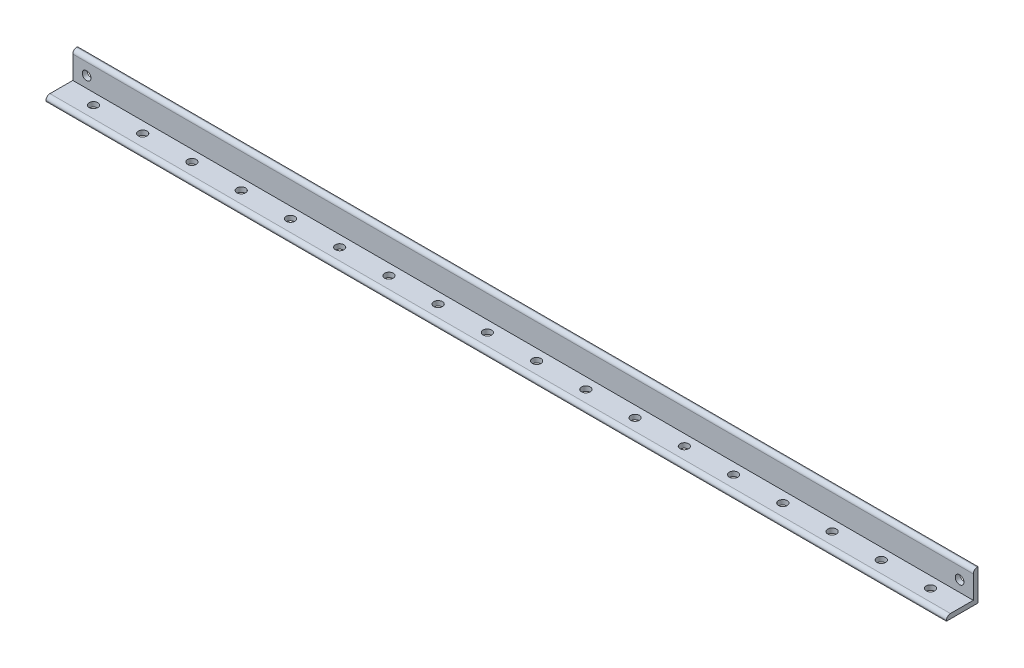
ISO-10303-21;
HEADER;
FILE_DESCRIPTION(('STEP AP214'),'2;1');
FILE_NAME('part.step','',(''),(''),'','','');
FILE_SCHEMA(('AUTOMOTIVE_DESIGN { 1 0 10303 214 1 1 1 1 }'));
ENDSEC;
DATA;
#1=APPLICATION_CONTEXT('core data for automotive mechanical design processes');
#2=APPLICATION_PROTOCOL_DEFINITION('international standard','automotive_design',2000,#1);
#3=PRODUCT_CONTEXT('',#1,'mechanical');
#4=PRODUCT('Part','Part','',(#3));
#5=PRODUCT_RELATED_PRODUCT_CATEGORY('part','',(#4));
#6=PRODUCT_DEFINITION_FORMATION('','',#4);
#7=PRODUCT_DEFINITION_CONTEXT('part definition',#1,'design');
#8=PRODUCT_DEFINITION('design','',#6,#7);
#9=PRODUCT_DEFINITION_SHAPE('','',#8);
#10=(LENGTH_UNIT() NAMED_UNIT(*) SI_UNIT(.MILLI.,.METRE.));
#11=(NAMED_UNIT(*) PLANE_ANGLE_UNIT() SI_UNIT($,.RADIAN.));
#12=(NAMED_UNIT(*) SI_UNIT($,.STERADIAN.) SOLID_ANGLE_UNIT());
#13=UNCERTAINTY_MEASURE_WITH_UNIT(LENGTH_MEASURE(1.E-05),#10,'distance_accuracy_value','');
#14=(GEOMETRIC_REPRESENTATION_CONTEXT(3) GLOBAL_UNCERTAINTY_ASSIGNED_CONTEXT((#13)) GLOBAL_UNIT_ASSIGNED_CONTEXT((#10,
#11,#12)) REPRESENTATION_CONTEXT('',''));
#15=CARTESIAN_POINT('',(0.,0.,0.));
#16=DIRECTION('',(0.,0.,1.));
#17=DIRECTION('',(1.,0.,0.));
#18=AXIS2_PLACEMENT_3D('',#15,#16,#17);
#19=CARTESIAN_POINT('',(0.,0.,80.));
#20=DIRECTION('',(1.,0.,0.));
#21=DIRECTION('',(0.,0.,-1.));
#22=AXIS2_PLACEMENT_3D('',#19,#20,#21);
#23=PLANE('',#22);
#24=DIRECTION('',(0.,-1.,0.));
#25=VECTOR('',#24,1.);
#26=CARTESIAN_POINT('',(0.,0.,80.));
#27=LINE('',#26,#25);
#28=CARTESIAN_POINT('',(0.,2.,80.));
#29=VERTEX_POINT('',#28);
#30=CARTESIAN_POINT('',(0.,0.,80.));
#31=VERTEX_POINT('',#30);
#32=EDGE_CURVE('E128',#29,#31,#27,.T.);
#33=ORIENTED_EDGE('',*,*,#32,.F.);
#34=CARTESIAN_POINT('',(0.,2.,70.));
#35=DIRECTION('',(1.,0.,0.));
#36=DIRECTION('',(0.,0.,-1.));
#37=AXIS2_PLACEMENT_3D('',#34,#35,#36);
#38=CIRCLE('',#37,10.);
#39=CARTESIAN_POINT('',(0.,12.,70.));
#40=VERTEX_POINT('',#39);
#41=EDGE_CURVE('E160',#29,#40,#38,.F.);
#42=ORIENTED_EDGE('',*,*,#41,.T.);
#43=DIRECTION('',(0.,0.,1.));
#44=VECTOR('',#43,1.);
#45=CARTESIAN_POINT('',(0.,12.,12.));
#46=LINE('',#45,#44);
#47=CARTESIAN_POINT('',(0.,12.,12.));
#48=VERTEX_POINT('',#47);
#49=EDGE_CURVE('E106',#48,#40,#46,.T.);
#50=ORIENTED_EDGE('',*,*,#49,.F.);
#51=DIRECTION('',(0.,-1.,0.));
#52=VECTOR('',#51,1.);
#53=CARTESIAN_POINT('',(0.,80.,12.));
#54=LINE('',#53,#52);
#55=CARTESIAN_POINT('',(0.,70.,12.));
#56=VERTEX_POINT('',#55);
#57=EDGE_CURVE('E112',#56,#48,#54,.T.);
#58=ORIENTED_EDGE('',*,*,#57,.F.);
#59=CARTESIAN_POINT('',(0.,70.,2.));
#60=DIRECTION('',(1.,0.,0.));
#61=DIRECTION('',(0.,0.,-1.));
#62=AXIS2_PLACEMENT_3D('',#59,#60,#61);
#63=CIRCLE('',#62,10.);
#64=CARTESIAN_POINT('',(0.,80.,2.));
#65=VERTEX_POINT('',#64);
#66=EDGE_CURVE('E158',#56,#65,#63,.F.);
#67=ORIENTED_EDGE('',*,*,#66,.T.);
#68=DIRECTION('',(0.,0.,-1.));
#69=VECTOR('',#68,1.);
#70=CARTESIAN_POINT('',(0.,80.,80.));
#71=LINE('',#70,#69);
#72=CARTESIAN_POINT('',(0.,80.,0.));
#73=VERTEX_POINT('',#72);
#74=EDGE_CURVE('E136',#65,#73,#71,.T.);
#75=ORIENTED_EDGE('',*,*,#74,.T.);
#76=DIRECTION('',(0.,-1.,0.));
#77=VECTOR('',#76,1.);
#78=CARTESIAN_POINT('',(0.,0.,0.));
#79=LINE('',#78,#77);
#80=CARTESIAN_POINT('',(0.,0.,0.));
#81=VERTEX_POINT('',#80);
#82=EDGE_CURVE('E116',#73,#81,#79,.T.);
#83=ORIENTED_EDGE('',*,*,#82,.T.);
#84=DIRECTION('',(0.,0.,-1.));
#85=VECTOR('',#84,1.);
#86=CARTESIAN_POINT('',(0.,0.,80.));
#87=LINE('',#86,#85);
#88=EDGE_CURVE('E152',#31,#81,#87,.T.);
#89=ORIENTED_EDGE('',*,*,#88,.F.);
#90=EDGE_LOOP('',(#33,#42,#50,#58,#67,#75,#83,#89));
#91=FACE_BOUND('',#90,.T.);
#92=ADVANCED_FACE('F33',(#91),#23,.F.);
#93=CARTESIAN_POINT('',(0.,0.,80.));
#94=DIRECTION('',(0.,1.,0.));
#95=DIRECTION('',(0.,0.,1.));
#96=AXIS2_PLACEMENT_3D('',#93,#94,#95);
#97=PLANE('',#96);
#98=CARTESIAN_POINT('',(205.5,0.,40.));
#99=DIRECTION('',(0.,-1.,0.));
#100=DIRECTION('',(0.,0.,-1.));
#101=AXIS2_PLACEMENT_3D('',#98,#99,#100);
#102=CIRCLE('',#101,10.9999999999999);
#103=CARTESIAN_POINT('',(205.5,0.,29.0000000000001));
#104=VERTEX_POINT('',#103);
#105=EDGE_CURVE('E628',#104,#104,#102,.T.);
#106=ORIENTED_EDGE('',*,*,#105,.F.);
#107=EDGE_LOOP('',(#106));
#108=FACE_BOUND('',#107,.T.);
#109=CARTESIAN_POINT('',(80.5,0.,40.));
#110=DIRECTION('',(0.,-1.,0.));
#111=DIRECTION('',(0.,0.,-1.));
#112=AXIS2_PLACEMENT_3D('',#109,#110,#111);
#113=CIRCLE('',#112,10.9999999999999);
#114=CARTESIAN_POINT('',(80.5,0.,29.0000000000001));
#115=VERTEX_POINT('',#114);
#116=EDGE_CURVE('E180',#115,#115,#113,.T.);
#117=ORIENTED_EDGE('',*,*,#116,.F.);
#118=EDGE_LOOP('',(#117));
#119=FACE_BOUND('',#118,.T.);
#120=DIRECTION('',(1.,0.,0.));
#121=VECTOR('',#120,1.);
#122=CARTESIAN_POINT('',(0.,0.,0.));
#123=LINE('',#122,#121);
#124=CARTESIAN_POINT('',(2286.,0.,0.));
#125=VERTEX_POINT('',#124);
#126=EDGE_CURVE('E139',#81,#125,#123,.T.);
#127=ORIENTED_EDGE('',*,*,#126,.T.);
#128=DIRECTION('',(0.,0.,-1.));
#129=VECTOR('',#128,1.);
#130=CARTESIAN_POINT('',(2286.,0.,80.));
#131=LINE('',#130,#129);
#132=CARTESIAN_POINT('',(2286.,0.,80.));
#133=VERTEX_POINT('',#132);
#134=EDGE_CURVE('E149',#133,#125,#131,.T.);
#135=ORIENTED_EDGE('',*,*,#134,.F.);
#136=DIRECTION('',(1.,0.,0.));
#137=VECTOR('',#136,1.);
#138=CARTESIAN_POINT('',(0.,0.,80.));
#139=LINE('',#138,#137);
#140=EDGE_CURVE('E130',#31,#133,#139,.T.);
#141=ORIENTED_EDGE('',*,*,#140,.F.);
#142=ORIENTED_EDGE('',*,*,#88,.T.);
#143=EDGE_LOOP('',(#127,#135,#141,#142));
#144=FACE_BOUND('',#143,.T.);
#145=CARTESIAN_POINT('',(330.5,0.,40.));
#146=DIRECTION('',(0.,-1.,0.));
#147=DIRECTION('',(0.,0.,-1.));
#148=AXIS2_PLACEMENT_3D('',#145,#146,#147);
#149=CIRCLE('',#148,10.9999999999999);
#150=CARTESIAN_POINT('',(330.5,0.,29.0000000000001));
#151=VERTEX_POINT('',#150);
#152=EDGE_CURVE('E169',#151,#151,#149,.T.);
#153=ORIENTED_EDGE('',*,*,#152,.F.);
#154=EDGE_LOOP('',(#153));
#155=FACE_BOUND('',#154,.T.);
#156=CARTESIAN_POINT('',(455.5,0.,40.));
#157=DIRECTION('',(0.,-1.,0.));
#158=DIRECTION('',(0.,0.,-1.));
#159=AXIS2_PLACEMENT_3D('',#156,#157,#158);
#160=CIRCLE('',#159,10.9999999999999);
#161=CARTESIAN_POINT('',(455.5,0.,29.0000000000001));
#162=VERTEX_POINT('',#161);
#163=EDGE_CURVE('E186',#162,#162,#160,.T.);
#164=ORIENTED_EDGE('',*,*,#163,.F.);
#165=EDGE_LOOP('',(#164));
#166=FACE_BOUND('',#165,.T.);
#167=CARTESIAN_POINT('',(580.5,0.,40.));
#168=DIRECTION('',(0.,-1.,0.));
#169=DIRECTION('',(0.,0.,-1.));
#170=AXIS2_PLACEMENT_3D('',#167,#168,#169);
#171=CIRCLE('',#170,10.9999999999999);
#172=CARTESIAN_POINT('',(580.5,0.,29.0000000000001));
#173=VERTEX_POINT('',#172);
#174=EDGE_CURVE('E192',#173,#173,#171,.T.);
#175=ORIENTED_EDGE('',*,*,#174,.F.);
#176=EDGE_LOOP('',(#175));
#177=FACE_BOUND('',#176,.T.);
#178=CARTESIAN_POINT('',(705.5,0.,40.));
#179=DIRECTION('',(0.,-1.,0.));
#180=DIRECTION('',(0.,0.,-1.));
#181=AXIS2_PLACEMENT_3D('',#178,#179,#180);
#182=CIRCLE('',#181,10.9999999999999);
#183=CARTESIAN_POINT('',(705.5,0.,29.0000000000001));
#184=VERTEX_POINT('',#183);
#185=EDGE_CURVE('E198',#184,#184,#182,.T.);
#186=ORIENTED_EDGE('',*,*,#185,.F.);
#187=EDGE_LOOP('',(#186));
#188=FACE_BOUND('',#187,.T.);
#189=CARTESIAN_POINT('',(830.5,0.,40.));
#190=DIRECTION('',(0.,-1.,0.));
#191=DIRECTION('',(0.,0.,-1.));
#192=AXIS2_PLACEMENT_3D('',#189,#190,#191);
#193=CIRCLE('',#192,10.9999999999999);
#194=CARTESIAN_POINT('',(830.5,0.,29.0000000000001));
#195=VERTEX_POINT('',#194);
#196=EDGE_CURVE('E204',#195,#195,#193,.T.);
#197=ORIENTED_EDGE('',*,*,#196,.F.);
#198=EDGE_LOOP('',(#197));
#199=FACE_BOUND('',#198,.T.);
#200=CARTESIAN_POINT('',(955.5,0.,40.));
#201=DIRECTION('',(0.,-1.,0.));
#202=DIRECTION('',(0.,0.,-1.));
#203=AXIS2_PLACEMENT_3D('',#200,#201,#202);
#204=CIRCLE('',#203,10.9999999999999);
#205=CARTESIAN_POINT('',(955.5,0.,29.0000000000001));
#206=VERTEX_POINT('',#205);
#207=EDGE_CURVE('E210',#206,#206,#204,.T.);
#208=ORIENTED_EDGE('',*,*,#207,.F.);
#209=EDGE_LOOP('',(#208));
#210=FACE_BOUND('',#209,.T.);
#211=CARTESIAN_POINT('',(1080.5,0.,40.));
#212=DIRECTION('',(0.,-1.,0.));
#213=DIRECTION('',(0.,0.,-1.));
#214=AXIS2_PLACEMENT_3D('',#211,#212,#213);
#215=CIRCLE('',#214,10.9999999999999);
#216=CARTESIAN_POINT('',(1080.5,0.,29.0000000000001));
#217=VERTEX_POINT('',#216);
#218=EDGE_CURVE('E216',#217,#217,#215,.T.);
#219=ORIENTED_EDGE('',*,*,#218,.F.);
#220=EDGE_LOOP('',(#219));
#221=FACE_BOUND('',#220,.T.);
#222=CARTESIAN_POINT('',(1205.5,0.,40.));
#223=DIRECTION('',(0.,-1.,0.));
#224=DIRECTION('',(0.,0.,-1.));
#225=AXIS2_PLACEMENT_3D('',#222,#223,#224);
#226=CIRCLE('',#225,10.9999999999999);
#227=CARTESIAN_POINT('',(1205.5,0.,29.0000000000001));
#228=VERTEX_POINT('',#227);
#229=EDGE_CURVE('E222',#228,#228,#226,.T.);
#230=ORIENTED_EDGE('',*,*,#229,.F.);
#231=EDGE_LOOP('',(#230));
#232=FACE_BOUND('',#231,.T.);
#233=CARTESIAN_POINT('',(1330.5,0.,40.));
#234=DIRECTION('',(0.,-1.,0.));
#235=DIRECTION('',(0.,0.,-1.));
#236=AXIS2_PLACEMENT_3D('',#233,#234,#235);
#237=CIRCLE('',#236,10.9999999999999);
#238=CARTESIAN_POINT('',(1330.5,0.,29.0000000000001));
#239=VERTEX_POINT('',#238);
#240=EDGE_CURVE('E228',#239,#239,#237,.T.);
#241=ORIENTED_EDGE('',*,*,#240,.F.);
#242=EDGE_LOOP('',(#241));
#243=FACE_BOUND('',#242,.T.);
#244=CARTESIAN_POINT('',(1455.5,0.,40.));
#245=DIRECTION('',(0.,-1.,0.));
#246=DIRECTION('',(0.,0.,-1.));
#247=AXIS2_PLACEMENT_3D('',#244,#245,#246);
#248=CIRCLE('',#247,10.9999999999999);
#249=CARTESIAN_POINT('',(1455.5,0.,29.0000000000001));
#250=VERTEX_POINT('',#249);
#251=EDGE_CURVE('E234',#250,#250,#248,.T.);
#252=ORIENTED_EDGE('',*,*,#251,.F.);
#253=EDGE_LOOP('',(#252));
#254=FACE_BOUND('',#253,.T.);
#255=CARTESIAN_POINT('',(1580.5,0.,40.));
#256=DIRECTION('',(0.,-1.,0.));
#257=DIRECTION('',(0.,0.,-1.));
#258=AXIS2_PLACEMENT_3D('',#255,#256,#257);
#259=CIRCLE('',#258,10.9999999999999);
#260=CARTESIAN_POINT('',(1580.5,0.,29.0000000000001));
#261=VERTEX_POINT('',#260);
#262=EDGE_CURVE('E240',#261,#261,#259,.T.);
#263=ORIENTED_EDGE('',*,*,#262,.F.);
#264=EDGE_LOOP('',(#263));
#265=FACE_BOUND('',#264,.T.);
#266=CARTESIAN_POINT('',(1705.5,0.,40.));
#267=DIRECTION('',(0.,-1.,0.));
#268=DIRECTION('',(0.,0.,-1.));
#269=AXIS2_PLACEMENT_3D('',#266,#267,#268);
#270=CIRCLE('',#269,10.9999999999999);
#271=CARTESIAN_POINT('',(1705.5,0.,29.0000000000001));
#272=VERTEX_POINT('',#271);
#273=EDGE_CURVE('E246',#272,#272,#270,.T.);
#274=ORIENTED_EDGE('',*,*,#273,.F.);
#275=EDGE_LOOP('',(#274));
#276=FACE_BOUND('',#275,.T.);
#277=CARTESIAN_POINT('',(1830.5,0.,40.));
#278=DIRECTION('',(0.,-1.,0.));
#279=DIRECTION('',(0.,0.,-1.));
#280=AXIS2_PLACEMENT_3D('',#277,#278,#279);
#281=CIRCLE('',#280,10.9999999999999);
#282=CARTESIAN_POINT('',(1830.5,0.,29.0000000000001));
#283=VERTEX_POINT('',#282);
#284=EDGE_CURVE('E252',#283,#283,#281,.T.);
#285=ORIENTED_EDGE('',*,*,#284,.F.);
#286=EDGE_LOOP('',(#285));
#287=FACE_BOUND('',#286,.T.);
#288=CARTESIAN_POINT('',(1955.5,0.,40.));
#289=DIRECTION('',(0.,-1.,0.));
#290=DIRECTION('',(0.,0.,-1.));
#291=AXIS2_PLACEMENT_3D('',#288,#289,#290);
#292=CIRCLE('',#291,10.9999999999999);
#293=CARTESIAN_POINT('',(1955.5,0.,29.0000000000001));
#294=VERTEX_POINT('',#293);
#295=EDGE_CURVE('E258',#294,#294,#292,.T.);
#296=ORIENTED_EDGE('',*,*,#295,.F.);
#297=EDGE_LOOP('',(#296));
#298=FACE_BOUND('',#297,.T.);
#299=CARTESIAN_POINT('',(2080.5,0.,40.));
#300=DIRECTION('',(0.,-1.,0.));
#301=DIRECTION('',(0.,0.,-1.));
#302=AXIS2_PLACEMENT_3D('',#299,#300,#301);
#303=CIRCLE('',#302,10.9999999999999);
#304=CARTESIAN_POINT('',(2080.5,0.,29.0000000000001));
#305=VERTEX_POINT('',#304);
#306=EDGE_CURVE('E264',#305,#305,#303,.T.);
#307=ORIENTED_EDGE('',*,*,#306,.F.);
#308=EDGE_LOOP('',(#307));
#309=FACE_BOUND('',#308,.T.);
#310=CARTESIAN_POINT('',(2205.5,0.,40.));
#311=DIRECTION('',(0.,-1.,0.));
#312=DIRECTION('',(0.,0.,-1.));
#313=AXIS2_PLACEMENT_3D('',#310,#311,#312);
#314=CIRCLE('',#313,10.9999999999999);
#315=CARTESIAN_POINT('',(2205.5,0.,29.0000000000001));
#316=VERTEX_POINT('',#315);
#317=EDGE_CURVE('E41',#316,#316,#314,.T.);
#318=ORIENTED_EDGE('',*,*,#317,.F.);
#319=EDGE_LOOP('',(#318));
#320=FACE_BOUND('',#319,.T.);
#321=ADVANCED_FACE('F274',(#108,#119,#144,#155,#166,#177,#188,#199,#210,#221,#232,#243,#254,
#265,#276,#287,#298,#309,#320),#97,.F.);
#322=CARTESIAN_POINT('',(2286.,0.,80.));
#323=DIRECTION('',(-1.,0.,0.));
#324=DIRECTION('',(0.,0.,1.));
#325=AXIS2_PLACEMENT_3D('',#322,#323,#324);
#326=PLANE('',#325);
#327=DIRECTION('',(0.,0.,1.));
#328=VECTOR('',#327,1.);
#329=CARTESIAN_POINT('',(2286.,12.,12.));
#330=LINE('',#329,#328);
#331=CARTESIAN_POINT('',(2286.,12.,12.));
#332=VERTEX_POINT('',#331);
#333=CARTESIAN_POINT('',(2286.,12.,70.));
#334=VERTEX_POINT('',#333);
#335=EDGE_CURVE('E101',#332,#334,#330,.T.);
#336=ORIENTED_EDGE('',*,*,#335,.T.);
#337=CARTESIAN_POINT('',(2286.,2.,70.));
#338=DIRECTION('',(-1.,0.,0.));
#339=DIRECTION('',(0.,0.,1.));
#340=AXIS2_PLACEMENT_3D('',#337,#338,#339);
#341=CIRCLE('',#340,10.);
#342=CARTESIAN_POINT('',(2286.,2.,80.));
#343=VERTEX_POINT('',#342);
#344=EDGE_CURVE('E164',#334,#343,#341,.F.);
#345=ORIENTED_EDGE('',*,*,#344,.T.);
#346=DIRECTION('',(0.,1.,0.));
#347=VECTOR('',#346,1.);
#348=CARTESIAN_POINT('',(2286.,0.,80.));
#349=LINE('',#348,#347);
#350=EDGE_CURVE('E133',#133,#343,#349,.T.);
#351=ORIENTED_EDGE('',*,*,#350,.F.);
#352=ORIENTED_EDGE('',*,*,#134,.T.);
#353=DIRECTION('',(0.,1.,0.));
#354=VECTOR('',#353,1.);
#355=CARTESIAN_POINT('',(2286.,0.,0.));
#356=LINE('',#355,#354);
#357=CARTESIAN_POINT('',(2286.,80.,0.));
#358=VERTEX_POINT('',#357);
#359=EDGE_CURVE('E141',#125,#358,#356,.T.);
#360=ORIENTED_EDGE('',*,*,#359,.T.);
#361=DIRECTION('',(0.,0.,-1.));
#362=VECTOR('',#361,1.);
#363=CARTESIAN_POINT('',(2286.,80.,80.));
#364=LINE('',#363,#362);
#365=CARTESIAN_POINT('',(2286.,80.,2.));
#366=VERTEX_POINT('',#365);
#367=EDGE_CURVE('E147',#366,#358,#364,.T.);
#368=ORIENTED_EDGE('',*,*,#367,.F.);
#369=CARTESIAN_POINT('',(2286.,70.,2.));
#370=DIRECTION('',(-1.,0.,0.));
#371=DIRECTION('',(0.,0.,1.));
#372=AXIS2_PLACEMENT_3D('',#369,#370,#371);
#373=CIRCLE('',#372,10.);
#374=CARTESIAN_POINT('',(2286.,70.,12.));
#375=VERTEX_POINT('',#374);
#376=EDGE_CURVE('E48',#366,#375,#373,.F.);
#377=ORIENTED_EDGE('',*,*,#376,.T.);
#378=DIRECTION('',(0.,-1.,0.));
#379=VECTOR('',#378,1.);
#380=CARTESIAN_POINT('',(2286.,80.,12.));
#381=LINE('',#380,#379);
#382=EDGE_CURVE('E97',#375,#332,#381,.T.);
#383=ORIENTED_EDGE('',*,*,#382,.T.);
#384=EDGE_LOOP('',(#336,#345,#351,#352,#360,#368,#377,#383));
#385=FACE_BOUND('',#384,.T.);
#386=ADVANCED_FACE('F99',(#385),#326,.F.);
#387=CARTESIAN_POINT('',(0.,80.,80.));
#388=DIRECTION('',(0.,-1.,0.));
#389=DIRECTION('',(0.,0.,-1.));
#390=AXIS2_PLACEMENT_3D('',#387,#388,#389);
#391=PLANE('',#390);
#392=ORIENTED_EDGE('',*,*,#74,.F.);
#393=DIRECTION('',(-1.,0.,0.));
#394=VECTOR('',#393,1.);
#395=CARTESIAN_POINT('',(0.,80.,2.));
#396=LINE('',#395,#394);
#397=EDGE_CURVE('E56',#65,#366,#396,.F.);
#398=ORIENTED_EDGE('',*,*,#397,.T.);
#399=ORIENTED_EDGE('',*,*,#367,.T.);
#400=DIRECTION('',(-1.,0.,0.));
#401=VECTOR('',#400,1.);
#402=CARTESIAN_POINT('',(0.,80.,0.));
#403=LINE('',#402,#401);
#404=EDGE_CURVE('E131',#358,#73,#403,.T.);
#405=ORIENTED_EDGE('',*,*,#404,.T.);
#406=EDGE_LOOP('',(#392,#398,#399,#405));
#407=FACE_BOUND('',#406,.T.);
#408=ADVANCED_FACE('F282',(#407),#391,.F.);
#409=CARTESIAN_POINT('',(0.,80.,80.));
#410=DIRECTION('',(0.,0.,-1.));
#411=DIRECTION('',(-1.,0.,0.));
#412=AXIS2_PLACEMENT_3D('',#409,#410,#411);
#413=PLANE('',#412);
#414=ORIENTED_EDGE('',*,*,#350,.T.);
#415=DIRECTION('',(-1.,0.,0.));
#416=VECTOR('',#415,1.);
#417=CARTESIAN_POINT('',(0.,2.,80.));
#418=LINE('',#417,#416);
#419=EDGE_CURVE('E155',#343,#29,#418,.T.);
#420=ORIENTED_EDGE('',*,*,#419,.T.);
#421=ORIENTED_EDGE('',*,*,#32,.T.);
#422=ORIENTED_EDGE('',*,*,#140,.T.);
#423=EDGE_LOOP('',(#414,#420,#421,#422));
#424=FACE_BOUND('',#423,.T.);
#425=ADVANCED_FACE('F381',(#424),#413,.F.);
#426=CARTESIAN_POINT('',(0.,80.,0.));
#427=DIRECTION('',(0.,0.,-1.));
#428=DIRECTION('',(-1.,0.,0.));
#429=AXIS2_PLACEMENT_3D('',#426,#427,#428);
#430=PLANE('',#429);
#431=CARTESIAN_POINT('',(35.0731120000001,40.,0.));
#432=DIRECTION('',(0.,0.,-1.));
#433=DIRECTION('',(-1.,0.,0.));
#434=AXIS2_PLACEMENT_3D('',#431,#432,#433);
#435=CIRCLE('',#434,11.0000000000001);
#436=CARTESIAN_POINT('',(24.0731119999999,40.,0.));
#437=VERTEX_POINT('',#436);
#438=EDGE_CURVE('E176',#437,#437,#435,.T.);
#439=ORIENTED_EDGE('',*,*,#438,.F.);
#440=EDGE_LOOP('',(#439));
#441=FACE_BOUND('',#440,.T.);
#442=CARTESIAN_POINT('',(2251.25,40.,0.));
#443=DIRECTION('',(0.,0.,-1.));
#444=DIRECTION('',(-1.,0.,0.));
#445=AXIS2_PLACEMENT_3D('',#442,#443,#444);
#446=CIRCLE('',#445,11.0000000000001);
#447=CARTESIAN_POINT('',(2240.25,40.,0.));
#448=VERTEX_POINT('',#447);
#449=EDGE_CURVE('E172',#448,#448,#446,.T.);
#450=ORIENTED_EDGE('',*,*,#449,.F.);
#451=EDGE_LOOP('',(#450));
#452=FACE_BOUND('',#451,.T.);
#453=ORIENTED_EDGE('',*,*,#82,.F.);
#454=ORIENTED_EDGE('',*,*,#404,.F.);
#455=ORIENTED_EDGE('',*,*,#359,.F.);
#456=ORIENTED_EDGE('',*,*,#126,.F.);
#457=EDGE_LOOP('',(#453,#454,#455,#456));
#458=FACE_BOUND('',#457,.T.);
#459=ADVANCED_FACE('F373',(#441,#452,#458),#430,.T.);
#460=CARTESIAN_POINT('',(2286.,80.,12.));
#461=DIRECTION('',(0.,0.,-1.));
#462=DIRECTION('',(0.,1.,0.));
#463=AXIS2_PLACEMENT_3D('',#460,#461,#462);
#464=PLANE('',#463);
#465=CARTESIAN_POINT('',(35.0731120000001,40.,12.));
#466=DIRECTION('',(0.,0.,-1.));
#467=DIRECTION('',(0.,1.,0.));
#468=AXIS2_PLACEMENT_3D('',#465,#466,#467);
#469=CIRCLE('',#468,11.0000000000001);
#470=CARTESIAN_POINT('',(35.0731120000001,51.0000000000001,12.));
#471=VERTEX_POINT('',#470);
#472=EDGE_CURVE('E173',#471,#471,#469,.T.);
#473=ORIENTED_EDGE('',*,*,#472,.T.);
#474=EDGE_LOOP('',(#473));
#475=FACE_BOUND('',#474,.T.);
#476=CARTESIAN_POINT('',(2251.25,40.,12.));
#477=DIRECTION('',(0.,0.,-1.));
#478=DIRECTION('',(0.,1.,0.));
#479=AXIS2_PLACEMENT_3D('',#476,#477,#478);
#480=CIRCLE('',#479,11.0000000000001);
#481=CARTESIAN_POINT('',(2251.25,51.0000000000001,12.));
#482=VERTEX_POINT('',#481);
#483=EDGE_CURVE('E126',#482,#482,#480,.T.);
#484=ORIENTED_EDGE('',*,*,#483,.T.);
#485=EDGE_LOOP('',(#484));
#486=FACE_BOUND('',#485,.T.);
#487=ORIENTED_EDGE('',*,*,#382,.F.);
#488=DIRECTION('',(-1.,0.,0.));
#489=VECTOR('',#488,1.);
#490=CARTESIAN_POINT('',(2286.,70.,12.));
#491=LINE('',#490,#489);
#492=EDGE_CURVE('E166',#375,#56,#491,.T.);
#493=ORIENTED_EDGE('',*,*,#492,.T.);
#494=ORIENTED_EDGE('',*,*,#57,.T.);
#495=DIRECTION('',(-1.,0.,0.));
#496=VECTOR('',#495,1.);
#497=CARTESIAN_POINT('',(2286.,12.,12.));
#498=LINE('',#497,#496);
#499=EDGE_CURVE('E109',#332,#48,#498,.T.);
#500=ORIENTED_EDGE('',*,*,#499,.F.);
#501=EDGE_LOOP('',(#487,#493,#494,#500));
#502=FACE_BOUND('',#501,.T.);
#503=ADVANCED_FACE('F110',(#475,#486,#502),#464,.F.);
#504=CARTESIAN_POINT('',(2286.,12.,12.));
#505=DIRECTION('',(0.,-1.,0.));
#506=DIRECTION('',(0.,0.,-1.));
#507=AXIS2_PLACEMENT_3D('',#504,#505,#506);
#508=PLANE('',#507);
#509=CARTESIAN_POINT('',(205.5,12.,40.));
#510=DIRECTION('',(0.,-1.,0.));
#511=DIRECTION('',(0.,0.,-1.));
#512=AXIS2_PLACEMENT_3D('',#509,#510,#511);
#513=CIRCLE('',#512,10.9999999999999);
#514=CARTESIAN_POINT('',(205.5,12.,29.0000000000001));
#515=VERTEX_POINT('',#514);
#516=EDGE_CURVE('E630',#515,#515,#513,.T.);
#517=ORIENTED_EDGE('',*,*,#516,.T.);
#518=EDGE_LOOP('',(#517));
#519=FACE_BOUND('',#518,.T.);
#520=CARTESIAN_POINT('',(80.5,12.,40.));
#521=DIRECTION('',(0.,-1.,0.));
#522=DIRECTION('',(0.,0.,-1.));
#523=AXIS2_PLACEMENT_3D('',#520,#521,#522);
#524=CIRCLE('',#523,10.9999999999999);
#525=CARTESIAN_POINT('',(80.5,12.,29.0000000000001));
#526=VERTEX_POINT('',#525);
#527=EDGE_CURVE('E177',#526,#526,#524,.T.);
#528=ORIENTED_EDGE('',*,*,#527,.T.);
#529=EDGE_LOOP('',(#528));
#530=FACE_BOUND('',#529,.T.);
#531=ORIENTED_EDGE('',*,*,#49,.T.);
#532=DIRECTION('',(-1.,0.,0.));
#533=VECTOR('',#532,1.);
#534=CARTESIAN_POINT('',(2286.,12.,70.));
#535=LINE('',#534,#533);
#536=EDGE_CURVE('E121',#40,#334,#535,.F.);
#537=ORIENTED_EDGE('',*,*,#536,.T.);
#538=ORIENTED_EDGE('',*,*,#335,.F.);
#539=ORIENTED_EDGE('',*,*,#499,.T.);
#540=EDGE_LOOP('',(#531,#537,#538,#539));
#541=FACE_BOUND('',#540,.T.);
#542=CARTESIAN_POINT('',(330.5,12.,40.));
#543=DIRECTION('',(0.,-1.,0.));
#544=DIRECTION('',(0.,0.,-1.));
#545=AXIS2_PLACEMENT_3D('',#542,#543,#544);
#546=CIRCLE('',#545,10.9999999999999);
#547=CARTESIAN_POINT('',(330.5,12.,29.0000000000001));
#548=VERTEX_POINT('',#547);
#549=EDGE_CURVE('E183',#548,#548,#546,.T.);
#550=ORIENTED_EDGE('',*,*,#549,.T.);
#551=EDGE_LOOP('',(#550));
#552=FACE_BOUND('',#551,.T.);
#553=CARTESIAN_POINT('',(455.5,12.,40.));
#554=DIRECTION('',(0.,-1.,0.));
#555=DIRECTION('',(0.,0.,-1.));
#556=AXIS2_PLACEMENT_3D('',#553,#554,#555);
#557=CIRCLE('',#556,10.9999999999999);
#558=CARTESIAN_POINT('',(455.5,12.,29.0000000000001));
#559=VERTEX_POINT('',#558);
#560=EDGE_CURVE('E189',#559,#559,#557,.T.);
#561=ORIENTED_EDGE('',*,*,#560,.T.);
#562=EDGE_LOOP('',(#561));
#563=FACE_BOUND('',#562,.T.);
#564=CARTESIAN_POINT('',(580.5,12.,40.));
#565=DIRECTION('',(0.,-1.,0.));
#566=DIRECTION('',(0.,0.,-1.));
#567=AXIS2_PLACEMENT_3D('',#564,#565,#566);
#568=CIRCLE('',#567,10.9999999999999);
#569=CARTESIAN_POINT('',(580.5,12.,29.0000000000001));
#570=VERTEX_POINT('',#569);
#571=EDGE_CURVE('E195',#570,#570,#568,.T.);
#572=ORIENTED_EDGE('',*,*,#571,.T.);
#573=EDGE_LOOP('',(#572));
#574=FACE_BOUND('',#573,.T.);
#575=CARTESIAN_POINT('',(705.5,12.,40.));
#576=DIRECTION('',(0.,-1.,0.));
#577=DIRECTION('',(0.,0.,-1.));
#578=AXIS2_PLACEMENT_3D('',#575,#576,#577);
#579=CIRCLE('',#578,10.9999999999999);
#580=CARTESIAN_POINT('',(705.5,12.,29.0000000000001));
#581=VERTEX_POINT('',#580);
#582=EDGE_CURVE('E201',#581,#581,#579,.T.);
#583=ORIENTED_EDGE('',*,*,#582,.T.);
#584=EDGE_LOOP('',(#583));
#585=FACE_BOUND('',#584,.T.);
#586=CARTESIAN_POINT('',(830.5,12.,40.));
#587=DIRECTION('',(0.,-1.,0.));
#588=DIRECTION('',(0.,0.,-1.));
#589=AXIS2_PLACEMENT_3D('',#586,#587,#588);
#590=CIRCLE('',#589,10.9999999999999);
#591=CARTESIAN_POINT('',(830.5,12.,29.0000000000001));
#592=VERTEX_POINT('',#591);
#593=EDGE_CURVE('E207',#592,#592,#590,.T.);
#594=ORIENTED_EDGE('',*,*,#593,.T.);
#595=EDGE_LOOP('',(#594));
#596=FACE_BOUND('',#595,.T.);
#597=CARTESIAN_POINT('',(955.5,12.,40.));
#598=DIRECTION('',(0.,-1.,0.));
#599=DIRECTION('',(0.,0.,-1.));
#600=AXIS2_PLACEMENT_3D('',#597,#598,#599);
#601=CIRCLE('',#600,10.9999999999999);
#602=CARTESIAN_POINT('',(955.5,12.,29.0000000000001));
#603=VERTEX_POINT('',#602);
#604=EDGE_CURVE('E213',#603,#603,#601,.T.);
#605=ORIENTED_EDGE('',*,*,#604,.T.);
#606=EDGE_LOOP('',(#605));
#607=FACE_BOUND('',#606,.T.);
#608=CARTESIAN_POINT('',(1080.5,12.,40.));
#609=DIRECTION('',(0.,-1.,0.));
#610=DIRECTION('',(0.,0.,-1.));
#611=AXIS2_PLACEMENT_3D('',#608,#609,#610);
#612=CIRCLE('',#611,10.9999999999999);
#613=CARTESIAN_POINT('',(1080.5,12.,29.0000000000001));
#614=VERTEX_POINT('',#613);
#615=EDGE_CURVE('E219',#614,#614,#612,.T.);
#616=ORIENTED_EDGE('',*,*,#615,.T.);
#617=EDGE_LOOP('',(#616));
#618=FACE_BOUND('',#617,.T.);
#619=CARTESIAN_POINT('',(1205.5,12.,40.));
#620=DIRECTION('',(0.,-1.,0.));
#621=DIRECTION('',(0.,0.,-1.));
#622=AXIS2_PLACEMENT_3D('',#619,#620,#621);
#623=CIRCLE('',#622,10.9999999999999);
#624=CARTESIAN_POINT('',(1205.5,12.,29.0000000000001));
#625=VERTEX_POINT('',#624);
#626=EDGE_CURVE('E225',#625,#625,#623,.T.);
#627=ORIENTED_EDGE('',*,*,#626,.T.);
#628=EDGE_LOOP('',(#627));
#629=FACE_BOUND('',#628,.T.);
#630=CARTESIAN_POINT('',(1330.5,12.,40.));
#631=DIRECTION('',(0.,-1.,0.));
#632=DIRECTION('',(0.,0.,-1.));
#633=AXIS2_PLACEMENT_3D('',#630,#631,#632);
#634=CIRCLE('',#633,10.9999999999999);
#635=CARTESIAN_POINT('',(1330.5,12.,29.0000000000001));
#636=VERTEX_POINT('',#635);
#637=EDGE_CURVE('E231',#636,#636,#634,.T.);
#638=ORIENTED_EDGE('',*,*,#637,.T.);
#639=EDGE_LOOP('',(#638));
#640=FACE_BOUND('',#639,.T.);
#641=CARTESIAN_POINT('',(1455.5,12.,40.));
#642=DIRECTION('',(0.,-1.,0.));
#643=DIRECTION('',(0.,0.,-1.));
#644=AXIS2_PLACEMENT_3D('',#641,#642,#643);
#645=CIRCLE('',#644,10.9999999999999);
#646=CARTESIAN_POINT('',(1455.5,12.,29.0000000000001));
#647=VERTEX_POINT('',#646);
#648=EDGE_CURVE('E237',#647,#647,#645,.T.);
#649=ORIENTED_EDGE('',*,*,#648,.T.);
#650=EDGE_LOOP('',(#649));
#651=FACE_BOUND('',#650,.T.);
#652=CARTESIAN_POINT('',(1580.5,12.,40.));
#653=DIRECTION('',(0.,-1.,0.));
#654=DIRECTION('',(0.,0.,-1.));
#655=AXIS2_PLACEMENT_3D('',#652,#653,#654);
#656=CIRCLE('',#655,10.9999999999999);
#657=CARTESIAN_POINT('',(1580.5,12.,29.0000000000001));
#658=VERTEX_POINT('',#657);
#659=EDGE_CURVE('E243',#658,#658,#656,.T.);
#660=ORIENTED_EDGE('',*,*,#659,.T.);
#661=EDGE_LOOP('',(#660));
#662=FACE_BOUND('',#661,.T.);
#663=CARTESIAN_POINT('',(1705.5,12.,40.));
#664=DIRECTION('',(0.,-1.,0.));
#665=DIRECTION('',(0.,0.,-1.));
#666=AXIS2_PLACEMENT_3D('',#663,#664,#665);
#667=CIRCLE('',#666,10.9999999999999);
#668=CARTESIAN_POINT('',(1705.5,12.,29.0000000000001));
#669=VERTEX_POINT('',#668);
#670=EDGE_CURVE('E249',#669,#669,#667,.T.);
#671=ORIENTED_EDGE('',*,*,#670,.T.);
#672=EDGE_LOOP('',(#671));
#673=FACE_BOUND('',#672,.T.);
#674=CARTESIAN_POINT('',(1830.5,12.,40.));
#675=DIRECTION('',(0.,-1.,0.));
#676=DIRECTION('',(0.,0.,-1.));
#677=AXIS2_PLACEMENT_3D('',#674,#675,#676);
#678=CIRCLE('',#677,10.9999999999999);
#679=CARTESIAN_POINT('',(1830.5,12.,29.0000000000001));
#680=VERTEX_POINT('',#679);
#681=EDGE_CURVE('E255',#680,#680,#678,.T.);
#682=ORIENTED_EDGE('',*,*,#681,.T.);
#683=EDGE_LOOP('',(#682));
#684=FACE_BOUND('',#683,.T.);
#685=CARTESIAN_POINT('',(1955.5,12.,40.));
#686=DIRECTION('',(0.,-1.,0.));
#687=DIRECTION('',(0.,0.,-1.));
#688=AXIS2_PLACEMENT_3D('',#685,#686,#687);
#689=CIRCLE('',#688,10.9999999999999);
#690=CARTESIAN_POINT('',(1955.5,12.,29.0000000000001));
#691=VERTEX_POINT('',#690);
#692=EDGE_CURVE('E261',#691,#691,#689,.T.);
#693=ORIENTED_EDGE('',*,*,#692,.T.);
#694=EDGE_LOOP('',(#693));
#695=FACE_BOUND('',#694,.T.);
#696=CARTESIAN_POINT('',(2080.5,12.,40.));
#697=DIRECTION('',(0.,-1.,0.));
#698=DIRECTION('',(0.,0.,-1.));
#699=AXIS2_PLACEMENT_3D('',#696,#697,#698);
#700=CIRCLE('',#699,10.9999999999999);
#701=CARTESIAN_POINT('',(2080.5,12.,29.0000000000001));
#702=VERTEX_POINT('',#701);
#703=EDGE_CURVE('E267',#702,#702,#700,.T.);
#704=ORIENTED_EDGE('',*,*,#703,.T.);
#705=EDGE_LOOP('',(#704));
#706=FACE_BOUND('',#705,.T.);
#707=CARTESIAN_POINT('',(2205.5,12.,40.));
#708=DIRECTION('',(0.,-1.,0.));
#709=DIRECTION('',(0.,0.,-1.));
#710=AXIS2_PLACEMENT_3D('',#707,#708,#709);
#711=CIRCLE('',#710,10.9999999999999);
#712=CARTESIAN_POINT('',(2205.5,12.,29.0000000000001));
#713=VERTEX_POINT('',#712);
#714=EDGE_CURVE('E11',#713,#713,#711,.T.);
#715=ORIENTED_EDGE('',*,*,#714,.T.);
#716=EDGE_LOOP('',(#715));
#717=FACE_BOUND('',#716,.T.);
#718=ADVANCED_FACE('F118',(#519,#530,#541,#552,#563,#574,#585,#596,#607,#618,#629,#640,#651,
#662,#673,#684,#695,#706,#717),#508,.F.);
#719=CARTESIAN_POINT('',(0.,2.,70.));
#720=DIRECTION('',(-1.,0.,0.));
#721=DIRECTION('',(0.,0.,1.));
#722=AXIS2_PLACEMENT_3D('',#719,#720,#721);
#723=CYLINDRICAL_SURFACE('',#722,10.);
#724=ORIENTED_EDGE('',*,*,#344,.F.);
#725=ORIENTED_EDGE('',*,*,#536,.F.);
#726=ORIENTED_EDGE('',*,*,#41,.F.);
#727=ORIENTED_EDGE('',*,*,#419,.F.);
#728=EDGE_LOOP('',(#724,#725,#726,#727));
#729=FACE_BOUND('',#728,.T.);
#730=ADVANCED_FACE('F290',(#729),#723,.T.);
#731=CARTESIAN_POINT('',(2286.,70.,2.));
#732=DIRECTION('',(-1.,0.,0.));
#733=DIRECTION('',(0.,0.,1.));
#734=AXIS2_PLACEMENT_3D('',#731,#732,#733);
#735=CYLINDRICAL_SURFACE('',#734,10.);
#736=ORIENTED_EDGE('',*,*,#376,.F.);
#737=ORIENTED_EDGE('',*,*,#397,.F.);
#738=ORIENTED_EDGE('',*,*,#66,.F.);
#739=ORIENTED_EDGE('',*,*,#492,.F.);
#740=EDGE_LOOP('',(#736,#737,#738,#739));
#741=FACE_BOUND('',#740,.T.);
#742=ADVANCED_FACE('F293',(#741),#735,.T.);
#743=CARTESIAN_POINT('',(2251.25,40.,80.));
#744=DIRECTION('',(0.,0.,-1.));
#745=DIRECTION('',(-1.,0.,0.));
#746=AXIS2_PLACEMENT_3D('',#743,#744,#745);
#747=CYLINDRICAL_SURFACE('',#746,11.0000000000001);
#748=ORIENTED_EDGE('',*,*,#449,.T.);
#749=EDGE_LOOP('',(#748));
#750=FACE_BOUND('',#749,.T.);
#751=ORIENTED_EDGE('',*,*,#483,.F.);
#752=EDGE_LOOP('',(#751));
#753=FACE_BOUND('',#752,.T.);
#754=ADVANCED_FACE('F297',(#750,#753),#747,.F.);
#755=CARTESIAN_POINT('',(35.0731120000001,40.,80.));
#756=DIRECTION('',(0.,0.,-1.));
#757=DIRECTION('',(-1.,0.,0.));
#758=AXIS2_PLACEMENT_3D('',#755,#756,#757);
#759=CYLINDRICAL_SURFACE('',#758,11.0000000000001);
#760=ORIENTED_EDGE('',*,*,#438,.T.);
#761=EDGE_LOOP('',(#760));
#762=FACE_BOUND('',#761,.T.);
#763=ORIENTED_EDGE('',*,*,#472,.F.);
#764=EDGE_LOOP('',(#763));
#765=FACE_BOUND('',#764,.T.);
#766=ADVANCED_FACE('F493',(#762,#765),#759,.F.);
#767=CARTESIAN_POINT('',(80.5,80.,40.));
#768=DIRECTION('',(0.,-1.,0.));
#769=DIRECTION('',(0.,0.,-1.));
#770=AXIS2_PLACEMENT_3D('',#767,#768,#769);
#771=CYLINDRICAL_SURFACE('',#770,10.9999999999999);
#772=ORIENTED_EDGE('',*,*,#116,.T.);
#773=EDGE_LOOP('',(#772));
#774=FACE_BOUND('',#773,.T.);
#775=ORIENTED_EDGE('',*,*,#527,.F.);
#776=EDGE_LOOP('',(#775));
#777=FACE_BOUND('',#776,.T.);
#778=ADVANCED_FACE('F498',(#774,#777),#771,.F.);
#779=CARTESIAN_POINT('',(205.5,80.,40.));
#780=DIRECTION('',(0.,-1.,0.));
#781=DIRECTION('',(0.,0.,-1.));
#782=AXIS2_PLACEMENT_3D('',#779,#780,#781);
#783=CYLINDRICAL_SURFACE('',#782,10.9999999999999);
#784=ORIENTED_EDGE('',*,*,#105,.T.);
#785=EDGE_LOOP('',(#784));
#786=FACE_BOUND('',#785,.T.);
#787=ORIENTED_EDGE('',*,*,#516,.F.);
#788=EDGE_LOOP('',(#787));
#789=FACE_BOUND('',#788,.T.);
#790=ADVANCED_FACE('F303',(#786,#789),#783,.F.);
#791=CARTESIAN_POINT('',(330.5,80.,40.));
#792=DIRECTION('',(0.,-1.,0.));
#793=DIRECTION('',(0.,0.,-1.));
#794=AXIS2_PLACEMENT_3D('',#791,#792,#793);
#795=CYLINDRICAL_SURFACE('',#794,10.9999999999999);
#796=ORIENTED_EDGE('',*,*,#152,.T.);
#797=EDGE_LOOP('',(#796));
#798=FACE_BOUND('',#797,.T.);
#799=ORIENTED_EDGE('',*,*,#549,.F.);
#800=EDGE_LOOP('',(#799));
#801=FACE_BOUND('',#800,.T.);
#802=ADVANCED_FACE('F299',(#798,#801),#795,.F.);
#803=CARTESIAN_POINT('',(455.5,80.,40.));
#804=DIRECTION('',(0.,-1.,0.));
#805=DIRECTION('',(0.,0.,-1.));
#806=AXIS2_PLACEMENT_3D('',#803,#804,#805);
#807=CYLINDRICAL_SURFACE('',#806,10.9999999999999);
#808=ORIENTED_EDGE('',*,*,#163,.T.);
#809=EDGE_LOOP('',(#808));
#810=FACE_BOUND('',#809,.T.);
#811=ORIENTED_EDGE('',*,*,#560,.F.);
#812=EDGE_LOOP('',(#811));
#813=FACE_BOUND('',#812,.T.);
#814=ADVANCED_FACE('F302',(#810,#813),#807,.F.);
#815=CARTESIAN_POINT('',(580.5,80.,40.));
#816=DIRECTION('',(0.,-1.,0.));
#817=DIRECTION('',(0.,0.,-1.));
#818=AXIS2_PLACEMENT_3D('',#815,#816,#817);
#819=CYLINDRICAL_SURFACE('',#818,10.9999999999999);
#820=ORIENTED_EDGE('',*,*,#174,.T.);
#821=EDGE_LOOP('',(#820));
#822=FACE_BOUND('',#821,.T.);
#823=ORIENTED_EDGE('',*,*,#571,.F.);
#824=EDGE_LOOP('',(#823));
#825=FACE_BOUND('',#824,.T.);
#826=ADVANCED_FACE('F307',(#822,#825),#819,.F.);
#827=CARTESIAN_POINT('',(705.5,80.,40.));
#828=DIRECTION('',(0.,-1.,0.));
#829=DIRECTION('',(0.,0.,-1.));
#830=AXIS2_PLACEMENT_3D('',#827,#828,#829);
#831=CYLINDRICAL_SURFACE('',#830,10.9999999999999);
#832=ORIENTED_EDGE('',*,*,#185,.T.);
#833=EDGE_LOOP('',(#832));
#834=FACE_BOUND('',#833,.T.);
#835=ORIENTED_EDGE('',*,*,#582,.F.);
#836=EDGE_LOOP('',(#835));
#837=FACE_BOUND('',#836,.T.);
#838=ADVANCED_FACE('F311',(#834,#837),#831,.F.);
#839=CARTESIAN_POINT('',(830.5,80.,40.));
#840=DIRECTION('',(0.,-1.,0.));
#841=DIRECTION('',(0.,0.,-1.));
#842=AXIS2_PLACEMENT_3D('',#839,#840,#841);
#843=CYLINDRICAL_SURFACE('',#842,10.9999999999999);
#844=ORIENTED_EDGE('',*,*,#196,.T.);
#845=EDGE_LOOP('',(#844));
#846=FACE_BOUND('',#845,.T.);
#847=ORIENTED_EDGE('',*,*,#593,.F.);
#848=EDGE_LOOP('',(#847));
#849=FACE_BOUND('',#848,.T.);
#850=ADVANCED_FACE('F315',(#846,#849),#843,.F.);
#851=CARTESIAN_POINT('',(955.5,80.,40.));
#852=DIRECTION('',(0.,-1.,0.));
#853=DIRECTION('',(0.,0.,-1.));
#854=AXIS2_PLACEMENT_3D('',#851,#852,#853);
#855=CYLINDRICAL_SURFACE('',#854,10.9999999999999);
#856=ORIENTED_EDGE('',*,*,#207,.T.);
#857=EDGE_LOOP('',(#856));
#858=FACE_BOUND('',#857,.T.);
#859=ORIENTED_EDGE('',*,*,#604,.F.);
#860=EDGE_LOOP('',(#859));
#861=FACE_BOUND('',#860,.T.);
#862=ADVANCED_FACE('F319',(#858,#861),#855,.F.);
#863=CARTESIAN_POINT('',(1080.5,80.,40.));
#864=DIRECTION('',(0.,-1.,0.));
#865=DIRECTION('',(0.,0.,-1.));
#866=AXIS2_PLACEMENT_3D('',#863,#864,#865);
#867=CYLINDRICAL_SURFACE('',#866,10.9999999999999);
#868=ORIENTED_EDGE('',*,*,#218,.T.);
#869=EDGE_LOOP('',(#868));
#870=FACE_BOUND('',#869,.T.);
#871=ORIENTED_EDGE('',*,*,#615,.F.);
#872=EDGE_LOOP('',(#871));
#873=FACE_BOUND('',#872,.T.);
#874=ADVANCED_FACE('F323',(#870,#873),#867,.F.);
#875=CARTESIAN_POINT('',(1205.5,80.,40.));
#876=DIRECTION('',(0.,-1.,0.));
#877=DIRECTION('',(0.,0.,-1.));
#878=AXIS2_PLACEMENT_3D('',#875,#876,#877);
#879=CYLINDRICAL_SURFACE('',#878,10.9999999999999);
#880=ORIENTED_EDGE('',*,*,#229,.T.);
#881=EDGE_LOOP('',(#880));
#882=FACE_BOUND('',#881,.T.);
#883=ORIENTED_EDGE('',*,*,#626,.F.);
#884=EDGE_LOOP('',(#883));
#885=FACE_BOUND('',#884,.T.);
#886=ADVANCED_FACE('F327',(#882,#885),#879,.F.);
#887=CARTESIAN_POINT('',(1330.5,80.,40.));
#888=DIRECTION('',(0.,-1.,0.));
#889=DIRECTION('',(0.,0.,-1.));
#890=AXIS2_PLACEMENT_3D('',#887,#888,#889);
#891=CYLINDRICAL_SURFACE('',#890,10.9999999999999);
#892=ORIENTED_EDGE('',*,*,#240,.T.);
#893=EDGE_LOOP('',(#892));
#894=FACE_BOUND('',#893,.T.);
#895=ORIENTED_EDGE('',*,*,#637,.F.);
#896=EDGE_LOOP('',(#895));
#897=FACE_BOUND('',#896,.T.);
#898=ADVANCED_FACE('F331',(#894,#897),#891,.F.);
#899=CARTESIAN_POINT('',(1455.5,80.,40.));
#900=DIRECTION('',(0.,-1.,0.));
#901=DIRECTION('',(0.,0.,-1.));
#902=AXIS2_PLACEMENT_3D('',#899,#900,#901);
#903=CYLINDRICAL_SURFACE('',#902,10.9999999999999);
#904=ORIENTED_EDGE('',*,*,#251,.T.);
#905=EDGE_LOOP('',(#904));
#906=FACE_BOUND('',#905,.T.);
#907=ORIENTED_EDGE('',*,*,#648,.F.);
#908=EDGE_LOOP('',(#907));
#909=FACE_BOUND('',#908,.T.);
#910=ADVANCED_FACE('F335',(#906,#909),#903,.F.);
#911=CARTESIAN_POINT('',(1580.5,80.,40.));
#912=DIRECTION('',(0.,-1.,0.));
#913=DIRECTION('',(0.,0.,-1.));
#914=AXIS2_PLACEMENT_3D('',#911,#912,#913);
#915=CYLINDRICAL_SURFACE('',#914,10.9999999999999);
#916=ORIENTED_EDGE('',*,*,#262,.T.);
#917=EDGE_LOOP('',(#916));
#918=FACE_BOUND('',#917,.T.);
#919=ORIENTED_EDGE('',*,*,#659,.F.);
#920=EDGE_LOOP('',(#919));
#921=FACE_BOUND('',#920,.T.);
#922=ADVANCED_FACE('F339',(#918,#921),#915,.F.);
#923=CARTESIAN_POINT('',(1705.5,80.,40.));
#924=DIRECTION('',(0.,-1.,0.));
#925=DIRECTION('',(0.,0.,-1.));
#926=AXIS2_PLACEMENT_3D('',#923,#924,#925);
#927=CYLINDRICAL_SURFACE('',#926,10.9999999999999);
#928=ORIENTED_EDGE('',*,*,#273,.T.);
#929=EDGE_LOOP('',(#928));
#930=FACE_BOUND('',#929,.T.);
#931=ORIENTED_EDGE('',*,*,#670,.F.);
#932=EDGE_LOOP('',(#931));
#933=FACE_BOUND('',#932,.T.);
#934=ADVANCED_FACE('F343',(#930,#933),#927,.F.);
#935=CARTESIAN_POINT('',(1830.5,80.,40.));
#936=DIRECTION('',(0.,-1.,0.));
#937=DIRECTION('',(0.,0.,-1.));
#938=AXIS2_PLACEMENT_3D('',#935,#936,#937);
#939=CYLINDRICAL_SURFACE('',#938,10.9999999999999);
#940=ORIENTED_EDGE('',*,*,#284,.T.);
#941=EDGE_LOOP('',(#940));
#942=FACE_BOUND('',#941,.T.);
#943=ORIENTED_EDGE('',*,*,#681,.F.);
#944=EDGE_LOOP('',(#943));
#945=FACE_BOUND('',#944,.T.);
#946=ADVANCED_FACE('F347',(#942,#945),#939,.F.);
#947=CARTESIAN_POINT('',(1955.5,80.,40.));
#948=DIRECTION('',(0.,-1.,0.));
#949=DIRECTION('',(0.,0.,-1.));
#950=AXIS2_PLACEMENT_3D('',#947,#948,#949);
#951=CYLINDRICAL_SURFACE('',#950,10.9999999999999);
#952=ORIENTED_EDGE('',*,*,#295,.T.);
#953=EDGE_LOOP('',(#952));
#954=FACE_BOUND('',#953,.T.);
#955=ORIENTED_EDGE('',*,*,#692,.F.);
#956=EDGE_LOOP('',(#955));
#957=FACE_BOUND('',#956,.T.);
#958=ADVANCED_FACE('F351',(#954,#957),#951,.F.);
#959=CARTESIAN_POINT('',(2080.5,80.,40.));
#960=DIRECTION('',(0.,-1.,0.));
#961=DIRECTION('',(0.,0.,-1.));
#962=AXIS2_PLACEMENT_3D('',#959,#960,#961);
#963=CYLINDRICAL_SURFACE('',#962,10.9999999999999);
#964=ORIENTED_EDGE('',*,*,#306,.T.);
#965=EDGE_LOOP('',(#964));
#966=FACE_BOUND('',#965,.T.);
#967=ORIENTED_EDGE('',*,*,#703,.F.);
#968=EDGE_LOOP('',(#967));
#969=FACE_BOUND('',#968,.T.);
#970=ADVANCED_FACE('F354',(#966,#969),#963,.F.);
#971=CARTESIAN_POINT('',(2205.5,80.,40.));
#972=DIRECTION('',(0.,-1.,0.));
#973=DIRECTION('',(0.,0.,-1.));
#974=AXIS2_PLACEMENT_3D('',#971,#972,#973);
#975=CYLINDRICAL_SURFACE('',#974,10.9999999999999);
#976=ORIENTED_EDGE('',*,*,#317,.T.);
#977=EDGE_LOOP('',(#976));
#978=FACE_BOUND('',#977,.T.);
#979=ORIENTED_EDGE('',*,*,#714,.F.);
#980=EDGE_LOOP('',(#979));
#981=FACE_BOUND('',#980,.T.);
#982=ADVANCED_FACE('F35',(#978,#981),#975,.F.);
#983=CLOSED_SHELL('',(#92,#321,#386,#408,#425,#459,#503,#718,#730,#742,#754,#766,#778,#790,#802,
#814,#826,#838,#850,#862,#874,#886,#898,#910,#922,#934,#946,#958,#970,#982));
#984=MANIFOLD_SOLID_BREP('B2',#983);
#985=ADVANCED_BREP_SHAPE_REPRESENTATION('',(#18,#984),#14);
#986=SHAPE_DEFINITION_REPRESENTATION(#9,#985);
ENDSEC;
END-ISO-10303-21;
